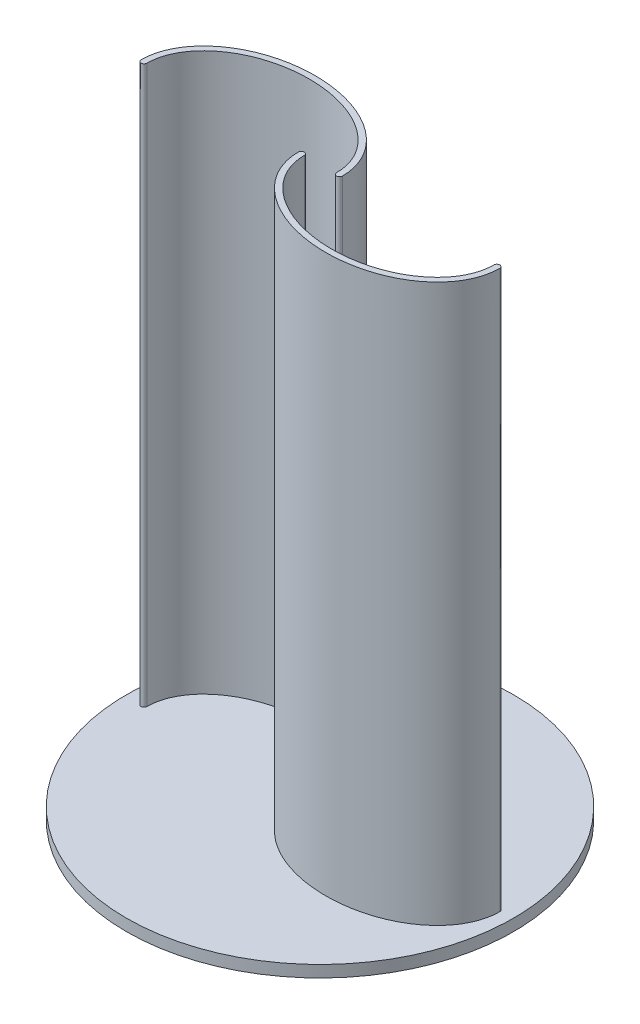
ISO-10303-21;
HEADER;
FILE_DESCRIPTION(('STEP AP214'),'2;1');
FILE_NAME('part.step','',(''),(''),'','','');
FILE_SCHEMA(('AUTOMOTIVE_DESIGN { 1 0 10303 214 1 1 1 1 }'));
ENDSEC;
DATA;
#1=APPLICATION_CONTEXT('core data for automotive mechanical design processes');
#2=APPLICATION_PROTOCOL_DEFINITION('international standard','automotive_design',2000,#1);
#3=PRODUCT_CONTEXT('',#1,'mechanical');
#4=PRODUCT('Part','Part','',(#3));
#5=PRODUCT_RELATED_PRODUCT_CATEGORY('part','',(#4));
#6=PRODUCT_DEFINITION_FORMATION('','',#4);
#7=PRODUCT_DEFINITION_CONTEXT('part definition',#1,'design');
#8=PRODUCT_DEFINITION('design','',#6,#7);
#9=PRODUCT_DEFINITION_SHAPE('','',#8);
#10=(LENGTH_UNIT() NAMED_UNIT(*) SI_UNIT(.MILLI.,.METRE.));
#11=(NAMED_UNIT(*) PLANE_ANGLE_UNIT() SI_UNIT($,.RADIAN.));
#12=(NAMED_UNIT(*) SI_UNIT($,.STERADIAN.) SOLID_ANGLE_UNIT());
#13=UNCERTAINTY_MEASURE_WITH_UNIT(LENGTH_MEASURE(1.E-05),#10,'distance_accuracy_value','');
#14=(GEOMETRIC_REPRESENTATION_CONTEXT(3) GLOBAL_UNCERTAINTY_ASSIGNED_CONTEXT((#13)) GLOBAL_UNIT_ASSIGNED_CONTEXT((#10,
#11,#12)) REPRESENTATION_CONTEXT('',''));
#15=CARTESIAN_POINT('',(0.,0.,0.));
#16=DIRECTION('',(0.,0.,1.));
#17=DIRECTION('',(1.,0.,0.));
#18=AXIS2_PLACEMENT_3D('',#15,#16,#17);
#19=CARTESIAN_POINT('',(33.333337,950.,0.));
#20=DIRECTION('',(0.,-1.,0.));
#21=DIRECTION('',(0.,0.,-1.));
#22=AXIS2_PLACEMENT_3D('',#19,#20,#21);
#23=CYLINDRICAL_SURFACE('',#22,5.);
#24=CARTESIAN_POINT('',(33.333337,0.,0.));
#25=DIRECTION('',(0.,-1.,0.));
#26=DIRECTION('',(0.,0.,-1.));
#27=AXIS2_PLACEMENT_3D('',#24,#25,#26);
#28=CIRCLE('',#27,5.);
#29=CARTESIAN_POINT('',(38.333337,0.,0.));
#30=VERTEX_POINT('',#29);
#31=CARTESIAN_POINT('',(28.333337,0.,0.));
#32=VERTEX_POINT('',#31);
#33=EDGE_CURVE('E174',#30,#32,#28,.T.);
#34=ORIENTED_EDGE('',*,*,#33,.F.);
#35=DIRECTION('',(0.,-1.,0.));
#36=VECTOR('',#35,1.);
#37=CARTESIAN_POINT('',(38.333337,950.,0.));
#38=LINE('',#37,#36);
#39=CARTESIAN_POINT('',(38.333337,950.,0.));
#40=VERTEX_POINT('',#39);
#41=EDGE_CURVE('E11',#40,#30,#38,.T.);
#42=ORIENTED_EDGE('',*,*,#41,.F.);
#43=CARTESIAN_POINT('',(33.333337,950.,0.));
#44=DIRECTION('',(0.,-1.,0.));
#45=DIRECTION('',(0.,0.,-1.));
#46=AXIS2_PLACEMENT_3D('',#43,#44,#45);
#47=CIRCLE('',#46,5.);
#48=CARTESIAN_POINT('',(28.333337,950.,0.));
#49=VERTEX_POINT('',#48);
#50=EDGE_CURVE('E194',#40,#49,#47,.T.);
#51=ORIENTED_EDGE('',*,*,#50,.T.);
#52=DIRECTION('',(0.,-1.,0.));
#53=VECTOR('',#52,1.);
#54=CARTESIAN_POINT('',(28.333337,950.,0.));
#55=LINE('',#54,#53);
#56=EDGE_CURVE('E40',#49,#32,#55,.T.);
#57=ORIENTED_EDGE('',*,*,#56,.T.);
#58=EDGE_LOOP('',(#34,#42,#51,#57));
#59=FACE_BOUND('',#58,.T.);
#60=ADVANCED_FACE('F37',(#59),#23,.T.);
#61=CARTESIAN_POINT('',(38.333337,950.,0.));
#62=CARTESIAN_POINT('',(38.333337,950.,-8.32416784695633));
#63=CARTESIAN_POINT('',(36.056845897307,950.,-24.9169083442676));
#64=CARTESIAN_POINT('',(26.0031094937539,950.,-48.7583563285909));
#65=CARTESIAN_POINT('',(9.81412512378208,950.,-70.5416677371529));
#66=CARTESIAN_POINT('',(-11.8001920984238,950.,-89.4926308388952));
#67=CARTESIAN_POINT('',(-37.9774151170019,950.,-104.950721696558));
#68=CARTESIAN_POINT('',(-77.6262635697629,950.,-120.212163848007));
#69=CARTESIAN_POINT('',(-133.3333315,950.,-128.191890767995));
#70=CARTESIAN_POINT('',(-189.040399430237,950.,-120.212163848007));
#71=CARTESIAN_POINT('',(-228.689247882998,950.,-104.950721696558));
#72=CARTESIAN_POINT('',(-254.866470901576,950.,-89.4926308388952));
#73=CARTESIAN_POINT('',(-276.480788123782,950.,-70.5416677371529));
#74=CARTESIAN_POINT('',(-292.669772493754,950.,-48.7583563285909));
#75=CARTESIAN_POINT('',(-302.723508897307,950.,-24.9169083442677));
#76=CARTESIAN_POINT('',(-305.,950.,-8.32416784695636));
#77=CARTESIAN_POINT('',(-305.,950.,0.));
#78=B_SPLINE_CURVE_WITH_KNOTS('',3,(#61,#62,#63,#64,#65,#66,#67,#68,#69,#70,#71,#72,#73,#74,#75,
#76,#77),.UNSPECIFIED.,.F.,.F.,(4,1,1,1,1,1,1,1,1,1,1,1,1,1,4),(0.,0.196349540849362,
0.392699081698724,0.589048622548086,0.785398163397448,0.98174770424681,1.17809724509617,
1.5707963267949,1.96349540849362,2.15984494934298,2.35619449019234,2.55254403104171,
2.74889357189107,2.94524311274043,3.14159265358979),.UNSPECIFIED.);
#79=DIRECTION('',(0.,-1.,0.));
#80=VECTOR('',#79,1.);
#81=SURFACE_OF_LINEAR_EXTRUSION('',#78,#80);
#82=CARTESIAN_POINT('',(38.333337,0.,0.));
#83=CARTESIAN_POINT('',(38.333337,0.,-8.32416784695633));
#84=CARTESIAN_POINT('',(36.056845897307,0.,-24.9169083442676));
#85=CARTESIAN_POINT('',(26.0031094937539,0.,-48.7583563285909));
#86=CARTESIAN_POINT('',(9.81412512378208,0.,-70.5416677371529));
#87=CARTESIAN_POINT('',(-11.8001920984238,0.,-89.4926308388952));
#88=CARTESIAN_POINT('',(-37.9774151170019,0.,-104.950721696558));
#89=CARTESIAN_POINT('',(-77.6262635697629,0.,-120.212163848007));
#90=CARTESIAN_POINT('',(-133.3333315,0.,-128.191890767995));
#91=CARTESIAN_POINT('',(-189.040399430237,0.,-120.212163848007));
#92=CARTESIAN_POINT('',(-228.689247882998,0.,-104.950721696558));
#93=CARTESIAN_POINT('',(-254.866470901576,0.,-89.4926308388952));
#94=CARTESIAN_POINT('',(-276.480788123782,0.,-70.5416677371529));
#95=CARTESIAN_POINT('',(-292.669772493754,0.,-48.7583563285909));
#96=CARTESIAN_POINT('',(-302.723508897307,0.,-24.9169083442677));
#97=CARTESIAN_POINT('',(-305.,0.,-8.32416784695636));
#98=CARTESIAN_POINT('',(-305.,0.,0.));
#99=B_SPLINE_CURVE_WITH_KNOTS('',3,(#82,#83,#84,#85,#86,#87,#88,#89,#90,#91,#92,#93,#94,#95,#96,
#97,#98),.UNSPECIFIED.,.F.,.F.,(4,1,1,1,1,1,1,1,1,1,1,1,1,1,4),(0.,0.196349540849362,
0.392699081698724,0.589048622548086,0.785398163397448,0.98174770424681,1.17809724509617,
1.5707963267949,1.96349540849362,2.15984494934298,2.35619449019234,2.55254403104171,
2.74889357189107,2.94524311274043,3.14159265358979),.UNSPECIFIED.);
#100=CARTESIAN_POINT('',(-305.,0.,0.));
#101=VERTEX_POINT('',#100);
#102=EDGE_CURVE('E190',#30,#101,#99,.T.);
#103=ORIENTED_EDGE('',*,*,#102,.T.);
#104=DIRECTION('',(0.,-1.,0.));
#105=VECTOR('',#104,1.);
#106=CARTESIAN_POINT('',(-305.,950.,0.));
#107=LINE('',#106,#105);
#108=CARTESIAN_POINT('',(-305.,950.,0.));
#109=VERTEX_POINT('',#108);
#110=EDGE_CURVE('E45',#109,#101,#107,.T.);
#111=ORIENTED_EDGE('',*,*,#110,.F.);
#112=EDGE_CURVE('E166',#40,#109,#78,.T.);
#113=ORIENTED_EDGE('',*,*,#112,.F.);
#114=ORIENTED_EDGE('',*,*,#41,.T.);
#115=EDGE_LOOP('',(#103,#111,#113,#114));
#116=FACE_BOUND('',#115,.T.);
#117=ADVANCED_FACE('F160',(#116),#81,.F.);
#118=CARTESIAN_POINT('',(-300.,950.,0.));
#119=DIRECTION('',(0.,-1.,0.));
#120=DIRECTION('',(0.,0.,-1.));
#121=AXIS2_PLACEMENT_3D('',#118,#119,#120);
#122=CYLINDRICAL_SURFACE('',#121,5.);
#123=CARTESIAN_POINT('',(-300.,0.,0.));
#124=DIRECTION('',(0.,1.,0.));
#125=DIRECTION('',(0.,0.,1.));
#126=AXIS2_PLACEMENT_3D('',#123,#124,#125);
#127=CIRCLE('',#126,5.);
#128=CARTESIAN_POINT('',(-295.,0.,0.));
#129=VERTEX_POINT('',#128);
#130=EDGE_CURVE('E184',#101,#129,#127,.T.);
#131=ORIENTED_EDGE('',*,*,#130,.T.);
#132=DIRECTION('',(0.,-1.,0.));
#133=VECTOR('',#132,1.);
#134=CARTESIAN_POINT('',(-295.,950.,0.));
#135=LINE('',#134,#133);
#136=CARTESIAN_POINT('',(-295.,950.,0.));
#137=VERTEX_POINT('',#136);
#138=EDGE_CURVE('E200',#137,#129,#135,.T.);
#139=ORIENTED_EDGE('',*,*,#138,.F.);
#140=CARTESIAN_POINT('',(-300.,950.,0.));
#141=DIRECTION('',(0.,1.,0.));
#142=DIRECTION('',(0.,0.,1.));
#143=AXIS2_PLACEMENT_3D('',#140,#141,#142);
#144=CIRCLE('',#143,5.);
#145=EDGE_CURVE('E172',#109,#137,#144,.T.);
#146=ORIENTED_EDGE('',*,*,#145,.F.);
#147=ORIENTED_EDGE('',*,*,#110,.T.);
#148=EDGE_LOOP('',(#131,#139,#146,#147));
#149=FACE_BOUND('',#148,.T.);
#150=ADVANCED_FACE('F164',(#149),#122,.T.);
#151=CARTESIAN_POINT('',(28.333337,950.,0.));
#152=CARTESIAN_POINT('',(28.333337,950.,-3.7033929470189));
#153=CARTESIAN_POINT('',(27.8285661302043,950.,-11.0976089760018));
#154=CARTESIAN_POINT('',(24.8059049396608,950.,-25.7803667793238));
#155=CARTESIAN_POINT('',(17.2753467655531,950.,-43.679345104233));
#156=CARTESIAN_POINT('',(2.46229471512361,950.,-63.6541896786712));
#157=CARTESIAN_POINT('',(-17.6446786190842,950.,-81.3073736132116));
#158=CARTESIAN_POINT('',(-42.3059219224277,950.,-95.8871679878197));
#159=CARTESIAN_POINT('',(-70.5672294064514,950.,-106.767875215904));
#160=CARTESIAN_POINT('',(-101.315553617401,950.,-113.485868411676));
#161=CARTESIAN_POINT('',(-133.3333315,950.,-115.757065794162));
#162=CARTESIAN_POINT('',(-165.351109382599,950.,-113.485868411676));
#163=CARTESIAN_POINT('',(-196.099433593549,950.,-106.767875215904));
#164=CARTESIAN_POINT('',(-224.360741077572,950.,-95.8871679878197));
#165=CARTESIAN_POINT('',(-249.021984380916,950.,-81.3073736132116));
#166=CARTESIAN_POINT('',(-269.128957715124,950.,-63.6541896786712));
#167=CARTESIAN_POINT('',(-283.942009765553,950.,-43.6793451042329));
#168=CARTESIAN_POINT('',(-291.472567939661,950.,-25.7803667793238));
#169=CARTESIAN_POINT('',(-294.495229130204,950.,-11.0976089760018));
#170=CARTESIAN_POINT('',(-295.,950.,-3.70339294701892));
#171=CARTESIAN_POINT('',(-295.,950.,0.));
#172=B_SPLINE_CURVE_WITH_KNOTS('',3,(#151,#152,#153,#154,#155,#156,#157,#158,#159,#160,#161,
#162,#163,#164,#165,#166,#167,#168,#169,#170,#171),.UNSPECIFIED.,.F.,.F.,(4,1,1,1,1,1,1,1,1,1,1,
1,1,1,1,1,1,1,4),(0.,0.098174770424681,0.196349540849362,0.392699081698724,0.589048622548086,
0.785398163397448,0.98174770424681,1.17809724509617,1.37444678594553,1.5707963267949,
1.76714586764426,1.96349540849362,2.15984494934298,2.35619449019234,2.55254403104171,
2.74889357189107,2.94524311274043,3.04341788316511,3.14159265358979),.UNSPECIFIED.);
#173=DIRECTION('',(0.,-1.,0.));
#174=VECTOR('',#173,1.);
#175=SURFACE_OF_LINEAR_EXTRUSION('',#172,#174);
#176=CARTESIAN_POINT('',(28.333337,0.,0.));
#177=CARTESIAN_POINT('',(28.333337,0.,-3.7033929470189));
#178=CARTESIAN_POINT('',(27.8285661302043,0.,-11.0976089760018));
#179=CARTESIAN_POINT('',(24.8059049396608,0.,-25.7803667793238));
#180=CARTESIAN_POINT('',(17.2753467655531,0.,-43.679345104233));
#181=CARTESIAN_POINT('',(2.46229471512361,0.,-63.6541896786712));
#182=CARTESIAN_POINT('',(-17.6446786190842,0.,-81.3073736132116));
#183=CARTESIAN_POINT('',(-42.3059219224277,0.,-95.8871679878197));
#184=CARTESIAN_POINT('',(-70.5672294064514,0.,-106.767875215904));
#185=CARTESIAN_POINT('',(-101.315553617401,0.,-113.485868411676));
#186=CARTESIAN_POINT('',(-133.3333315,0.,-115.757065794162));
#187=CARTESIAN_POINT('',(-165.351109382599,0.,-113.485868411676));
#188=CARTESIAN_POINT('',(-196.099433593549,0.,-106.767875215904));
#189=CARTESIAN_POINT('',(-224.360741077572,0.,-95.8871679878197));
#190=CARTESIAN_POINT('',(-249.021984380916,0.,-81.3073736132116));
#191=CARTESIAN_POINT('',(-269.128957715124,0.,-63.6541896786712));
#192=CARTESIAN_POINT('',(-283.942009765553,0.,-43.6793451042329));
#193=CARTESIAN_POINT('',(-291.472567939661,0.,-25.7803667793238));
#194=CARTESIAN_POINT('',(-294.495229130204,0.,-11.0976089760018));
#195=CARTESIAN_POINT('',(-295.,0.,-3.70339294701892));
#196=CARTESIAN_POINT('',(-295.,0.,0.));
#197=B_SPLINE_CURVE_WITH_KNOTS('',3,(#176,#177,#178,#179,#180,#181,#182,#183,#184,#185,#186,
#187,#188,#189,#190,#191,#192,#193,#194,#195,#196),.UNSPECIFIED.,.F.,.F.,(4,1,1,1,1,1,1,1,1,1,1,
1,1,1,1,1,1,1,4),(0.,0.098174770424681,0.196349540849362,0.392699081698724,0.589048622548086,
0.785398163397448,0.98174770424681,1.17809724509617,1.37444678594553,1.5707963267949,
1.76714586764426,1.96349540849362,2.15984494934298,2.35619449019234,2.55254403104171,
2.74889357189107,2.94524311274043,3.04341788316511,3.14159265358979),.UNSPECIFIED.);
#198=EDGE_CURVE('E179',#32,#129,#197,.T.);
#199=ORIENTED_EDGE('',*,*,#198,.F.);
#200=ORIENTED_EDGE('',*,*,#56,.F.);
#201=EDGE_CURVE('E217',#49,#137,#172,.T.);
#202=ORIENTED_EDGE('',*,*,#201,.T.);
#203=ORIENTED_EDGE('',*,*,#138,.T.);
#204=EDGE_LOOP('',(#199,#200,#202,#203));
#205=FACE_BOUND('',#204,.T.);
#206=ADVANCED_FACE('F158',(#205),#175,.T.);
#207=CARTESIAN_POINT('',(33.333337,950.,0.));
#208=DIRECTION('',(0.,-1.,0.));
#209=DIRECTION('',(0.,0.,-1.));
#210=AXIS2_PLACEMENT_3D('',#207,#208,#209);
#211=PLANE('',#210);
#212=ORIENTED_EDGE('',*,*,#50,.F.);
#213=ORIENTED_EDGE('',*,*,#112,.T.);
#214=ORIENTED_EDGE('',*,*,#145,.T.);
#215=ORIENTED_EDGE('',*,*,#201,.F.);
#216=EDGE_LOOP('',(#212,#213,#214,#215));
#217=FACE_BOUND('',#216,.T.);
#218=ADVANCED_FACE('F154',(#217),#211,.F.);
#219=CARTESIAN_POINT('',(0.,-20.,0.));
#220=DIRECTION('',(0.,1.,0.));
#221=DIRECTION('',(0.,0.,1.));
#222=AXIS2_PLACEMENT_3D('',#219,#220,#221);
#223=CYLINDRICAL_SURFACE('',#222,330.);
#224=CARTESIAN_POINT('',(0.,-20.,0.));
#225=DIRECTION('',(0.,1.,0.));
#226=DIRECTION('',(0.,0.,1.));
#227=AXIS2_PLACEMENT_3D('',#224,#225,#226);
#228=CIRCLE('',#227,330.);
#229=CARTESIAN_POINT('',(0.,-20.,330.));
#230=VERTEX_POINT('',#229);
#231=EDGE_CURVE('E180',#230,#230,#228,.T.);
#232=ORIENTED_EDGE('',*,*,#231,.T.);
#233=EDGE_LOOP('',(#232));
#234=FACE_BOUND('',#233,.T.);
#235=CARTESIAN_POINT('',(0.,0.,0.));
#236=DIRECTION('',(0.,1.,0.));
#237=DIRECTION('',(0.,0.,1.));
#238=AXIS2_PLACEMENT_3D('',#235,#236,#237);
#239=CIRCLE('',#238,330.);
#240=CARTESIAN_POINT('',(0.,0.,330.));
#241=VERTEX_POINT('',#240);
#242=EDGE_CURVE('E220',#241,#241,#239,.T.);
#243=ORIENTED_EDGE('',*,*,#242,.F.);
#244=EDGE_LOOP('',(#243));
#245=FACE_BOUND('',#244,.T.);
#246=ADVANCED_FACE('F148',(#234,#245),#223,.T.);
#247=CARTESIAN_POINT('',(0.,-20.,0.));
#248=DIRECTION('',(0.,1.,0.));
#249=DIRECTION('',(0.,0.,1.));
#250=AXIS2_PLACEMENT_3D('',#247,#248,#249);
#251=PLANE('',#250);
#252=ORIENTED_EDGE('',*,*,#231,.F.);
#253=EDGE_LOOP('',(#252));
#254=FACE_BOUND('',#253,.T.);
#255=ADVANCED_FACE('F145',(#254),#251,.F.);
#256=CARTESIAN_POINT('',(0.,0.,0.));
#257=DIRECTION('',(0.,1.,0.));
#258=DIRECTION('',(0.,0.,1.));
#259=AXIS2_PLACEMENT_3D('',#256,#257,#258);
#260=PLANE('',#259);
#261=CARTESIAN_POINT('',(-29.6885281591651,0.,2.15641332769563));
#262=DIRECTION('',(0.,-1.,0.));
#263=DIRECTION('',(0.,0.,1.));
#264=AXIS2_PLACEMENT_3D('',#261,#262,#263);
#265=CIRCLE('',#264,5.);
#266=CARTESIAN_POINT('',(-34.6885281591651,2.22044604925031E-13,2.15641332769563));
#267=VERTEX_POINT('',#266);
#268=CARTESIAN_POINT('',(-24.6885281591651,0.,2.15641332769563));
#269=VERTEX_POINT('',#268);
#270=EDGE_CURVE('E312',#267,#269,#265,.T.);
#271=ORIENTED_EDGE('',*,*,#270,.T.);
#272=CARTESIAN_POINT('',(-24.6885281591651,0.,2.15641332769563));
#273=CARTESIAN_POINT('',(-24.6885281591651,0.,5.85980627471453));
#274=CARTESIAN_POINT('',(-24.1837572893694,0.,13.2540223036974));
#275=CARTESIAN_POINT('',(-21.1610960988259,0.,27.9367801070194));
#276=CARTESIAN_POINT('',(-13.6305379247183,0.,45.8357584319286));
#277=CARTESIAN_POINT('',(1.18251412571124,0.,65.8106030063668));
#278=CARTESIAN_POINT('',(21.289487459919,0.,83.4637869409072));
#279=CARTESIAN_POINT('',(45.9507307632626,0.,98.0435813155153));
#280=CARTESIAN_POINT('',(74.2120382472862,0.,108.9242885436));
#281=CARTESIAN_POINT('',(104.960362458236,0.,115.642281739371));
#282=CARTESIAN_POINT('',(136.978140340835,0.,117.913479121858));
#283=CARTESIAN_POINT('',(168.995918223434,0.,115.642281739371));
#284=CARTESIAN_POINT('',(199.744242434383,0.,108.9242885436));
#285=CARTESIAN_POINT('',(228.005549918407,0.,98.0435813155153));
#286=CARTESIAN_POINT('',(252.666793221751,0.,83.4637869409072));
#287=CARTESIAN_POINT('',(272.773766555959,0.,65.8106030063669));
#288=CARTESIAN_POINT('',(287.586818606388,0.,45.8357584319286));
#289=CARTESIAN_POINT('',(295.117376780496,0.,27.9367801070195));
#290=CARTESIAN_POINT('',(298.140037971039,0.,13.2540223036975));
#291=CARTESIAN_POINT('',(298.644808840835,0.,5.85980627471455));
#292=CARTESIAN_POINT('',(298.644808840835,0.,2.15641332769564));
#293=B_SPLINE_CURVE_WITH_KNOTS('',3,(#272,#273,#274,#275,#276,#277,#278,#279,#280,#281,#282,
#283,#284,#285,#286,#287,#288,#289,#290,#291,#292),.UNSPECIFIED.,.F.,.F.,(4,1,1,1,1,1,1,1,1,1,1,
1,1,1,1,1,1,1,4),(0.,0.098174770424681,0.196349540849362,0.392699081698724,0.589048622548086,
0.785398163397448,0.98174770424681,1.17809724509617,1.37444678594553,1.5707963267949,
1.76714586764426,1.96349540849362,2.15984494934298,2.35619449019234,2.55254403104171,
2.74889357189107,2.94524311274043,3.04341788316511,3.14159265358979),.UNSPECIFIED.);
#294=CARTESIAN_POINT('',(298.644808840835,2.22044604925031E-13,2.15641332769564));
#295=VERTEX_POINT('',#294);
#296=EDGE_CURVE('E107',#269,#295,#293,.T.);
#297=ORIENTED_EDGE('',*,*,#296,.T.);
#298=CARTESIAN_POINT('',(303.644808840835,0.,2.15641332769554));
#299=DIRECTION('',(0.,1.,0.));
#300=DIRECTION('',(0.,0.,-1.));
#301=AXIS2_PLACEMENT_3D('',#298,#299,#300);
#302=CIRCLE('',#301,5.);
#303=CARTESIAN_POINT('',(308.644808840835,0.,2.15641332769564));
#304=VERTEX_POINT('',#303);
#305=EDGE_CURVE('E58',#304,#295,#302,.T.);
#306=ORIENTED_EDGE('',*,*,#305,.F.);
#307=CARTESIAN_POINT('',(-34.6885281591651,0.,2.15641332769563));
#308=CARTESIAN_POINT('',(-34.6885281591651,0.,10.480581174652));
#309=CARTESIAN_POINT('',(-32.4120370564721,0.,27.0733216719633));
#310=CARTESIAN_POINT('',(-22.3583006529191,0.,50.9147696562866));
#311=CARTESIAN_POINT('',(-6.16931628294723,0.,72.6980810648485));
#312=CARTESIAN_POINT('',(15.4450009392586,0.,91.6490441665909));
#313=CARTESIAN_POINT('',(41.6222239578367,0.,107.107135024253));
#314=CARTESIAN_POINT('',(81.2710724105978,0.,122.368577175703));
#315=CARTESIAN_POINT('',(136.978140340835,0.,130.348304095691));
#316=CARTESIAN_POINT('',(192.685208271072,0.,122.368577175703));
#317=CARTESIAN_POINT('',(232.334056723833,0.,107.107135024253));
#318=CARTESIAN_POINT('',(258.511279742411,0.,91.6490441665909));
#319=CARTESIAN_POINT('',(280.125596964617,0.,72.6980810648486));
#320=CARTESIAN_POINT('',(296.314581334589,0.,50.9147696562866));
#321=CARTESIAN_POINT('',(306.368317738142,0.,27.0733216719633));
#322=CARTESIAN_POINT('',(308.644808840835,0.,10.480581174652));
#323=CARTESIAN_POINT('',(308.644808840835,0.,2.15641332769564));
#324=B_SPLINE_CURVE_WITH_KNOTS('',3,(#307,#308,#309,#310,#311,#312,#313,#314,#315,#316,#317,
#318,#319,#320,#321,#322,#323),.UNSPECIFIED.,.F.,.F.,(4,1,1,1,1,1,1,1,1,1,1,1,1,1,4),(0.,
0.196349540849362,0.392699081698724,0.589048622548086,0.785398163397448,0.98174770424681,
1.17809724509617,1.5707963267949,1.96349540849362,2.15984494934298,2.35619449019234,
2.55254403104171,2.74889357189107,2.94524311274043,3.14159265358979),.UNSPECIFIED.);
#325=EDGE_CURVE('E53',#267,#304,#324,.T.);
#326=ORIENTED_EDGE('',*,*,#325,.F.);
#327=EDGE_LOOP('',(#271,#297,#306,#326));
#328=FACE_BOUND('',#327,.T.);
#329=ORIENTED_EDGE('',*,*,#102,.F.);
#330=ORIENTED_EDGE('',*,*,#33,.T.);
#331=ORIENTED_EDGE('',*,*,#198,.T.);
#332=ORIENTED_EDGE('',*,*,#130,.F.);
#333=EDGE_LOOP('',(#329,#330,#331,#332));
#334=FACE_BOUND('',#333,.T.);
#335=ORIENTED_EDGE('',*,*,#242,.T.);
#336=EDGE_LOOP('',(#335));
#337=FACE_BOUND('',#336,.T.);
#338=ADVANCED_FACE('F144',(#328,#334,#337),#260,.T.);
#339=CARTESIAN_POINT('',(-29.6885281591651,950.,2.15641332769563));
#340=DIRECTION('',(0.,-1.,0.));
#341=DIRECTION('',(0.,0.,-1.));
#342=AXIS2_PLACEMENT_3D('',#339,#340,#341);
#343=CYLINDRICAL_SURFACE('',#342,5.);
#344=ORIENTED_EDGE('',*,*,#270,.F.);
#345=DIRECTION('',(0.,-1.,0.));
#346=VECTOR('',#345,1.);
#347=CARTESIAN_POINT('',(-34.6885281591651,950.,2.15641332769563));
#348=LINE('',#347,#346);
#349=CARTESIAN_POINT('',(-34.6885281591651,950.,2.15641332769563));
#350=VERTEX_POINT('',#349);
#351=EDGE_CURVE('E123',#350,#267,#348,.T.);
#352=ORIENTED_EDGE('',*,*,#351,.F.);
#353=CARTESIAN_POINT('',(-29.6885281591651,950.,2.15641332769563));
#354=DIRECTION('',(0.,-1.,0.));
#355=DIRECTION('',(0.,0.,1.));
#356=AXIS2_PLACEMENT_3D('',#353,#354,#355);
#357=CIRCLE('',#356,5.);
#358=CARTESIAN_POINT('',(-24.6885281591651,950.,2.15641332769563));
#359=VERTEX_POINT('',#358);
#360=EDGE_CURVE('E117',#350,#359,#357,.T.);
#361=ORIENTED_EDGE('',*,*,#360,.T.);
#362=DIRECTION('',(0.,-1.,0.));
#363=VECTOR('',#362,1.);
#364=CARTESIAN_POINT('',(-24.6885281591651,950.,2.15641332769563));
#365=LINE('',#364,#363);
#366=EDGE_CURVE('E102',#359,#269,#365,.T.);
#367=ORIENTED_EDGE('',*,*,#366,.T.);
#368=EDGE_LOOP('',(#344,#352,#361,#367));
#369=FACE_BOUND('',#368,.T.);
#370=ADVANCED_FACE('F122',(#369),#343,.T.);
#371=CARTESIAN_POINT('',(-34.6885281591651,950.,2.15641332769563));
#372=CARTESIAN_POINT('',(-34.6885281591651,950.,10.480581174652));
#373=CARTESIAN_POINT('',(-32.4120370564721,950.,27.0733216719633));
#374=CARTESIAN_POINT('',(-22.3583006529191,950.,50.9147696562866));
#375=CARTESIAN_POINT('',(-6.16931628294723,950.,72.6980810648485));
#376=CARTESIAN_POINT('',(15.4450009392586,950.,91.6490441665909));
#377=CARTESIAN_POINT('',(41.6222239578367,950.,107.107135024253));
#378=CARTESIAN_POINT('',(81.2710724105978,950.,122.368577175703));
#379=CARTESIAN_POINT('',(136.978140340835,950.,130.348304095691));
#380=CARTESIAN_POINT('',(192.685208271072,950.,122.368577175703));
#381=CARTESIAN_POINT('',(232.334056723833,950.,107.107135024253));
#382=CARTESIAN_POINT('',(258.511279742411,950.,91.6490441665909));
#383=CARTESIAN_POINT('',(280.125596964617,950.,72.6980810648486));
#384=CARTESIAN_POINT('',(296.314581334589,950.,50.9147696562866));
#385=CARTESIAN_POINT('',(306.368317738142,950.,27.0733216719633));
#386=CARTESIAN_POINT('',(308.644808840835,950.,10.480581174652));
#387=CARTESIAN_POINT('',(308.644808840835,950.,2.15641332769564));
#388=B_SPLINE_CURVE_WITH_KNOTS('',3,(#371,#372,#373,#374,#375,#376,#377,#378,#379,#380,#381,
#382,#383,#384,#385,#386,#387),.UNSPECIFIED.,.F.,.F.,(4,1,1,1,1,1,1,1,1,1,1,1,1,1,4),(0.,
0.196349540849362,0.392699081698724,0.589048622548086,0.785398163397448,0.98174770424681,
1.17809724509617,1.5707963267949,1.96349540849362,2.15984494934298,2.35619449019234,
2.55254403104171,2.74889357189107,2.94524311274043,3.14159265358979),.UNSPECIFIED.);
#389=DIRECTION('',(0.,-1.,0.));
#390=VECTOR('',#389,1.);
#391=SURFACE_OF_LINEAR_EXTRUSION('',#388,#390);
#392=ORIENTED_EDGE('',*,*,#325,.T.);
#393=DIRECTION('',(0.,-1.,0.));
#394=VECTOR('',#393,1.);
#395=CARTESIAN_POINT('',(308.644808840835,950.,2.15641332769564));
#396=LINE('',#395,#394);
#397=CARTESIAN_POINT('',(308.644808840835,950.,2.15641332769564));
#398=VERTEX_POINT('',#397);
#399=EDGE_CURVE('E330',#398,#304,#396,.T.);
#400=ORIENTED_EDGE('',*,*,#399,.F.);
#401=EDGE_CURVE('E112',#350,#398,#388,.T.);
#402=ORIENTED_EDGE('',*,*,#401,.F.);
#403=ORIENTED_EDGE('',*,*,#351,.T.);
#404=EDGE_LOOP('',(#392,#400,#402,#403));
#405=FACE_BOUND('',#404,.T.);
#406=ADVANCED_FACE('F143',(#405),#391,.F.);
#407=CARTESIAN_POINT('',(303.644808840835,950.,2.15641332769554));
#408=DIRECTION('',(0.,-1.,0.));
#409=DIRECTION('',(0.,0.,-1.));
#410=AXIS2_PLACEMENT_3D('',#407,#408,#409);
#411=CYLINDRICAL_SURFACE('',#410,5.);
#412=ORIENTED_EDGE('',*,*,#305,.T.);
#413=DIRECTION('',(0.,-1.,0.));
#414=VECTOR('',#413,1.);
#415=CARTESIAN_POINT('',(298.644808840835,950.,2.15641332769564));
#416=LINE('',#415,#414);
#417=CARTESIAN_POINT('',(298.644808840835,950.,2.15641332769564));
#418=VERTEX_POINT('',#417);
#419=EDGE_CURVE('E111',#418,#295,#416,.T.);
#420=ORIENTED_EDGE('',*,*,#419,.F.);
#421=CARTESIAN_POINT('',(303.644808840835,950.,2.15641332769554));
#422=DIRECTION('',(0.,1.,0.));
#423=DIRECTION('',(0.,0.,-1.));
#424=AXIS2_PLACEMENT_3D('',#421,#422,#423);
#425=CIRCLE('',#424,5.);
#426=EDGE_CURVE('E119',#398,#418,#425,.T.);
#427=ORIENTED_EDGE('',*,*,#426,.F.);
#428=ORIENTED_EDGE('',*,*,#399,.T.);
#429=EDGE_LOOP('',(#412,#420,#427,#428));
#430=FACE_BOUND('',#429,.T.);
#431=ADVANCED_FACE('F139',(#430),#411,.T.);
#432=CARTESIAN_POINT('',(-24.6885281591651,950.,2.15641332769563));
#433=CARTESIAN_POINT('',(-24.6885281591651,950.,5.85980627471453));
#434=CARTESIAN_POINT('',(-24.1837572893694,950.,13.2540223036974));
#435=CARTESIAN_POINT('',(-21.1610960988259,950.,27.9367801070194));
#436=CARTESIAN_POINT('',(-13.6305379247183,950.,45.8357584319286));
#437=CARTESIAN_POINT('',(1.18251412571124,950.,65.8106030063668));
#438=CARTESIAN_POINT('',(21.289487459919,950.,83.4637869409072));
#439=CARTESIAN_POINT('',(45.9507307632626,950.,98.0435813155153));
#440=CARTESIAN_POINT('',(74.2120382472862,950.,108.9242885436));
#441=CARTESIAN_POINT('',(104.960362458236,950.,115.642281739371));
#442=CARTESIAN_POINT('',(136.978140340835,950.,117.913479121858));
#443=CARTESIAN_POINT('',(168.995918223434,950.,115.642281739371));
#444=CARTESIAN_POINT('',(199.744242434383,950.,108.9242885436));
#445=CARTESIAN_POINT('',(228.005549918407,950.,98.0435813155153));
#446=CARTESIAN_POINT('',(252.666793221751,950.,83.4637869409072));
#447=CARTESIAN_POINT('',(272.773766555959,950.,65.8106030063669));
#448=CARTESIAN_POINT('',(287.586818606388,950.,45.8357584319286));
#449=CARTESIAN_POINT('',(295.117376780496,950.,27.9367801070195));
#450=CARTESIAN_POINT('',(298.140037971039,950.,13.2540223036975));
#451=CARTESIAN_POINT('',(298.644808840835,950.,5.85980627471455));
#452=CARTESIAN_POINT('',(298.644808840835,950.,2.15641332769564));
#453=B_SPLINE_CURVE_WITH_KNOTS('',3,(#432,#433,#434,#435,#436,#437,#438,#439,#440,#441,#442,
#443,#444,#445,#446,#447,#448,#449,#450,#451,#452),.UNSPECIFIED.,.F.,.F.,(4,1,1,1,1,1,1,1,1,1,1,
1,1,1,1,1,1,1,4),(0.,0.098174770424681,0.196349540849362,0.392699081698724,0.589048622548086,
0.785398163397448,0.98174770424681,1.17809724509617,1.37444678594553,1.5707963267949,
1.76714586764426,1.96349540849362,2.15984494934298,2.35619449019234,2.55254403104171,
2.74889357189107,2.94524311274043,3.04341788316511,3.14159265358979),.UNSPECIFIED.);
#454=DIRECTION('',(0.,-1.,0.));
#455=VECTOR('',#454,1.);
#456=SURFACE_OF_LINEAR_EXTRUSION('',#453,#455);
#457=ORIENTED_EDGE('',*,*,#296,.F.);
#458=ORIENTED_EDGE('',*,*,#366,.F.);
#459=EDGE_CURVE('E106',#359,#418,#453,.T.);
#460=ORIENTED_EDGE('',*,*,#459,.T.);
#461=ORIENTED_EDGE('',*,*,#419,.T.);
#462=EDGE_LOOP('',(#457,#458,#460,#461));
#463=FACE_BOUND('',#462,.T.);
#464=ADVANCED_FACE('F104',(#463),#456,.T.);
#465=CARTESIAN_POINT('',(-29.6885281591651,950.,2.15641332769563));
#466=DIRECTION('',(0.,-1.,0.));
#467=DIRECTION('',(0.,0.,1.));
#468=AXIS2_PLACEMENT_3D('',#465,#466,#467);
#469=PLANE('',#468);
#470=ORIENTED_EDGE('',*,*,#360,.F.);
#471=ORIENTED_EDGE('',*,*,#401,.T.);
#472=ORIENTED_EDGE('',*,*,#426,.T.);
#473=ORIENTED_EDGE('',*,*,#459,.F.);
#474=EDGE_LOOP('',(#470,#471,#472,#473));
#475=FACE_BOUND('',#474,.T.);
#476=ADVANCED_FACE('F116',(#475),#469,.F.);
#477=CLOSED_SHELL('',(#60,#117,#150,#206,#218,#246,#255,#338,#370,#406,#431,#464,#476));
#478=MANIFOLD_SOLID_BREP('B2',#477);
#479=ADVANCED_BREP_SHAPE_REPRESENTATION('',(#18,#478),#14);
#480=SHAPE_DEFINITION_REPRESENTATION(#9,#479);
ENDSEC;
END-ISO-10303-21;
